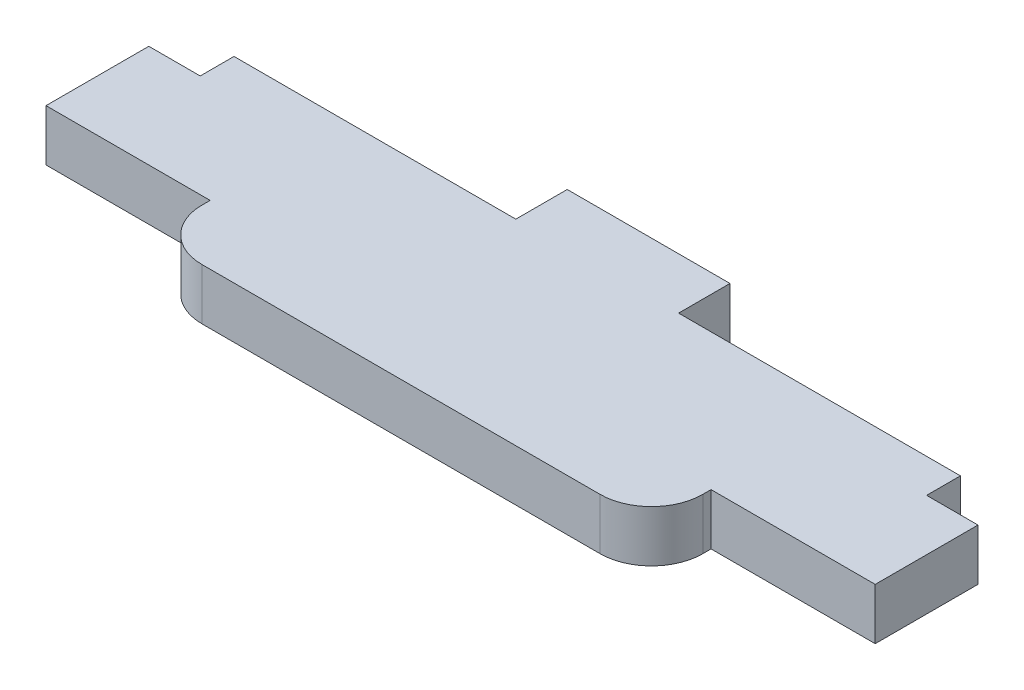
ISO-10303-21;
HEADER;
FILE_DESCRIPTION(('STEP AP214'),'2;1');
FILE_NAME('part.step','',(''),(''),'','','');
FILE_SCHEMA(('AUTOMOTIVE_DESIGN { 1 0 10303 214 1 1 1 1 }'));
ENDSEC;
DATA;
#1=APPLICATION_CONTEXT('core data for automotive mechanical design processes');
#2=APPLICATION_PROTOCOL_DEFINITION('international standard','automotive_design',2000,#1);
#3=PRODUCT_CONTEXT('',#1,'mechanical');
#4=PRODUCT('Part','Part','',(#3));
#5=PRODUCT_RELATED_PRODUCT_CATEGORY('part','',(#4));
#6=PRODUCT_DEFINITION_FORMATION('','',#4);
#7=PRODUCT_DEFINITION_CONTEXT('part definition',#1,'design');
#8=PRODUCT_DEFINITION('design','',#6,#7);
#9=PRODUCT_DEFINITION_SHAPE('','',#8);
#10=(LENGTH_UNIT() NAMED_UNIT(*) SI_UNIT(.MILLI.,.METRE.));
#11=(NAMED_UNIT(*) PLANE_ANGLE_UNIT() SI_UNIT($,.RADIAN.));
#12=(NAMED_UNIT(*) SI_UNIT($,.STERADIAN.) SOLID_ANGLE_UNIT());
#13=UNCERTAINTY_MEASURE_WITH_UNIT(LENGTH_MEASURE(1.E-05),#10,'distance_accuracy_value','');
#14=(GEOMETRIC_REPRESENTATION_CONTEXT(3) GLOBAL_UNCERTAINTY_ASSIGNED_CONTEXT((#13)) GLOBAL_UNIT_ASSIGNED_CONTEXT((#10,
#11,#12)) REPRESENTATION_CONTEXT('',''));
#15=CARTESIAN_POINT('',(0.,0.,0.));
#16=DIRECTION('',(0.,0.,1.));
#17=DIRECTION('',(1.,0.,0.));
#18=AXIS2_PLACEMENT_3D('',#15,#16,#17);
#19=CARTESIAN_POINT('',(70.0878100238819,6.,-6.40569379770578));
#20=DIRECTION('',(0.,-1.,0.));
#21=DIRECTION('',(0.,0.,-1.));
#22=AXIS2_PLACEMENT_3D('',#19,#20,#21);
#23=CYLINDRICAL_SURFACE('',#22,6.);
#24=CARTESIAN_POINT('',(70.0878100238819,0.,-6.40569379770578));
#25=DIRECTION('',(0.,1.,0.));
#26=DIRECTION('',(0.,0.,-1.));
#27=AXIS2_PLACEMENT_3D('',#24,#25,#26);
#28=CIRCLE('',#27,6.);
#29=CARTESIAN_POINT('',(70.0878100238819,0.,-0.405693797705776));
#30=VERTEX_POINT('',#29);
#31=CARTESIAN_POINT('',(76.0878100238819,0.,-6.40569379770582));
#32=VERTEX_POINT('',#31);
#33=EDGE_CURVE('E190',#30,#32,#28,.T.);
#34=ORIENTED_EDGE('',*,*,#33,.T.);
#35=DIRECTION('',(0.,-1.,0.));
#36=VECTOR('',#35,1.);
#37=CARTESIAN_POINT('',(76.0878100238819,6.,-6.40569379770582));
#38=LINE('',#37,#36);
#39=CARTESIAN_POINT('',(76.0878100238819,6.,-6.40569379770582));
#40=VERTEX_POINT('',#39);
#41=EDGE_CURVE('E11',#40,#32,#38,.T.);
#42=ORIENTED_EDGE('',*,*,#41,.F.);
#43=CARTESIAN_POINT('',(70.0878100238819,6.,-6.40569379770578));
#44=DIRECTION('',(0.,1.,0.));
#45=DIRECTION('',(0.,0.,-1.));
#46=AXIS2_PLACEMENT_3D('',#43,#44,#45);
#47=CIRCLE('',#46,6.);
#48=CARTESIAN_POINT('',(70.0878100238819,6.,-0.405693797705776));
#49=VERTEX_POINT('',#48);
#50=EDGE_CURVE('E225',#49,#40,#47,.T.);
#51=ORIENTED_EDGE('',*,*,#50,.F.);
#52=DIRECTION('',(0.,-1.,0.));
#53=VECTOR('',#52,1.);
#54=CARTESIAN_POINT('',(70.0878100238819,6.,-0.405693797705776));
#55=LINE('',#54,#53);
#56=EDGE_CURVE('E186',#49,#30,#55,.T.);
#57=ORIENTED_EDGE('',*,*,#56,.T.);
#58=EDGE_LOOP('',(#34,#42,#51,#57));
#59=FACE_BOUND('',#58,.T.);
#60=ADVANCED_FACE('F33',(#59),#23,.T.);
#61=CARTESIAN_POINT('',(76.0878100238819,6.,-7.36445307657716));
#62=DIRECTION('',(-1.,0.,0.));
#63=DIRECTION('',(0.,0.,1.));
#64=AXIS2_PLACEMENT_3D('',#61,#62,#63);
#65=PLANE('',#64);
#66=DIRECTION('',(0.,0.,-1.));
#67=VECTOR('',#66,1.);
#68=CARTESIAN_POINT('',(76.0878100238819,0.,-7.36445307657716));
#69=LINE('',#68,#67);
#70=CARTESIAN_POINT('',(76.0878100238819,0.,-7.36445307657716));
#71=VERTEX_POINT('',#70);
#72=EDGE_CURVE('E193',#32,#71,#69,.T.);
#73=ORIENTED_EDGE('',*,*,#72,.T.);
#74=DIRECTION('',(0.,-1.,0.));
#75=VECTOR('',#74,1.);
#76=CARTESIAN_POINT('',(76.0878100238819,6.,-7.36445307657716));
#77=LINE('',#76,#75);
#78=CARTESIAN_POINT('',(76.0878100238819,6.,-7.36445307657716));
#79=VERTEX_POINT('',#78);
#80=EDGE_CURVE('E41',#79,#71,#77,.T.);
#81=ORIENTED_EDGE('',*,*,#80,.F.);
#82=DIRECTION('',(0.,0.,-1.));
#83=VECTOR('',#82,1.);
#84=CARTESIAN_POINT('',(76.0878100238819,6.,-7.36445307657716));
#85=LINE('',#84,#83);
#86=EDGE_CURVE('E120',#40,#79,#85,.T.);
#87=ORIENTED_EDGE('',*,*,#86,.F.);
#88=ORIENTED_EDGE('',*,*,#41,.T.);
#89=EDGE_LOOP('',(#73,#81,#87,#88));
#90=FACE_BOUND('',#89,.T.);
#91=ADVANCED_FACE('F323',(#90),#65,.F.);
#92=CARTESIAN_POINT('',(95.2489083524591,6.,-7.36445307657716));
#93=DIRECTION('',(0.,0.,-1.));
#94=DIRECTION('',(-1.,0.,0.));
#95=AXIS2_PLACEMENT_3D('',#92,#93,#94);
#96=PLANE('',#95);
#97=DIRECTION('',(1.,0.,0.));
#98=VECTOR('',#97,1.);
#99=CARTESIAN_POINT('',(95.2489083524591,0.,-7.36445307657716));
#100=LINE('',#99,#98);
#101=CARTESIAN_POINT('',(95.2489083524591,0.,-7.36445307657716));
#102=VERTEX_POINT('',#101);
#103=EDGE_CURVE('E195',#71,#102,#100,.T.);
#104=ORIENTED_EDGE('',*,*,#103,.T.);
#105=DIRECTION('',(0.,-1.,0.));
#106=VECTOR('',#105,1.);
#107=CARTESIAN_POINT('',(95.2489083524591,6.,-7.36445307657716));
#108=LINE('',#107,#106);
#109=CARTESIAN_POINT('',(95.2489083524591,6.,-7.36445307657716));
#110=VERTEX_POINT('',#109);
#111=EDGE_CURVE('E262',#110,#102,#108,.T.);
#112=ORIENTED_EDGE('',*,*,#111,.F.);
#113=DIRECTION('',(1.,0.,0.));
#114=VECTOR('',#113,1.);
#115=CARTESIAN_POINT('',(95.2489083524591,6.,-7.36445307657716));
#116=LINE('',#115,#114);
#117=EDGE_CURVE('E270',#79,#110,#116,.T.);
#118=ORIENTED_EDGE('',*,*,#117,.F.);
#119=ORIENTED_EDGE('',*,*,#80,.T.);
#120=EDGE_LOOP('',(#104,#112,#118,#119));
#121=FACE_BOUND('',#120,.T.);
#122=ADVANCED_FACE('F268',(#121),#96,.F.);
#123=CARTESIAN_POINT('',(95.2489083524591,6.,-7.36445307657716));
#124=DIRECTION('',(-1.,0.,0.));
#125=DIRECTION('',(0.,0.,1.));
#126=AXIS2_PLACEMENT_3D('',#123,#124,#125);
#127=PLANE('',#126);
#128=DIRECTION('',(0.,0.,-1.));
#129=VECTOR('',#128,1.);
#130=CARTESIAN_POINT('',(95.2489083524591,0.,-7.36445307657716));
#131=LINE('',#130,#129);
#132=CARTESIAN_POINT('',(95.2489083524591,0.,-19.3644530765772));
#133=VERTEX_POINT('',#132);
#134=EDGE_CURVE('E197',#102,#133,#131,.T.);
#135=ORIENTED_EDGE('',*,*,#134,.T.);
#136=DIRECTION('',(0.,-1.,0.));
#137=VECTOR('',#136,1.);
#138=CARTESIAN_POINT('',(95.2489083524591,6.,-19.3644530765772));
#139=LINE('',#138,#137);
#140=CARTESIAN_POINT('',(95.2489083524591,6.,-19.3644530765772));
#141=VERTEX_POINT('',#140);
#142=EDGE_CURVE('E259',#141,#133,#139,.T.);
#143=ORIENTED_EDGE('',*,*,#142,.F.);
#144=DIRECTION('',(0.,0.,-1.));
#145=VECTOR('',#144,1.);
#146=CARTESIAN_POINT('',(95.2489083524591,6.,-7.36445307657716));
#147=LINE('',#146,#145);
#148=EDGE_CURVE('E286',#110,#141,#147,.T.);
#149=ORIENTED_EDGE('',*,*,#148,.F.);
#150=ORIENTED_EDGE('',*,*,#111,.T.);
#151=EDGE_LOOP('',(#135,#143,#149,#150));
#152=FACE_BOUND('',#151,.T.);
#153=ADVANCED_FACE('F277',(#152),#127,.F.);
#154=CARTESIAN_POINT('',(95.2489083524591,6.,-19.3644530765772));
#155=DIRECTION('',(0.,0.,1.));
#156=DIRECTION('',(1.,0.,0.));
#157=AXIS2_PLACEMENT_3D('',#154,#155,#156);
#158=PLANE('',#157);
#159=DIRECTION('',(-1.,0.,0.));
#160=VECTOR('',#159,1.);
#161=CARTESIAN_POINT('',(95.2489083524591,0.,-19.3644530765772));
#162=LINE('',#161,#160);
#163=CARTESIAN_POINT('',(89.2489083524591,0.,-19.3644530765772));
#164=VERTEX_POINT('',#163);
#165=EDGE_CURVE('E199',#133,#164,#162,.T.);
#166=ORIENTED_EDGE('',*,*,#165,.T.);
#167=DIRECTION('',(0.,-1.,0.));
#168=VECTOR('',#167,1.);
#169=CARTESIAN_POINT('',(89.2489083524591,6.,-19.3644530765772));
#170=LINE('',#169,#168);
#171=CARTESIAN_POINT('',(89.2489083524591,6.,-19.3644530765772));
#172=VERTEX_POINT('',#171);
#173=EDGE_CURVE('E256',#172,#164,#170,.T.);
#174=ORIENTED_EDGE('',*,*,#173,.F.);
#175=DIRECTION('',(-1.,0.,0.));
#176=VECTOR('',#175,1.);
#177=CARTESIAN_POINT('',(95.2489083524591,6.,-19.3644530765772));
#178=LINE('',#177,#176);
#179=EDGE_CURVE('E283',#141,#172,#178,.T.);
#180=ORIENTED_EDGE('',*,*,#179,.F.);
#181=ORIENTED_EDGE('',*,*,#142,.T.);
#182=EDGE_LOOP('',(#166,#174,#180,#181));
#183=FACE_BOUND('',#182,.T.);
#184=ADVANCED_FACE('F281',(#183),#158,.F.);
#185=CARTESIAN_POINT('',(89.2489083524591,6.,-19.3644530765772));
#186=DIRECTION('',(-1.,0.,0.));
#187=DIRECTION('',(0.,0.,1.));
#188=AXIS2_PLACEMENT_3D('',#185,#186,#187);
#189=PLANE('',#188);
#190=DIRECTION('',(0.,0.,-1.));
#191=VECTOR('',#190,1.);
#192=CARTESIAN_POINT('',(89.2489083524591,0.,-19.3644530765772));
#193=LINE('',#192,#191);
#194=CARTESIAN_POINT('',(89.2489083524591,0.,-23.3111134765772));
#195=VERTEX_POINT('',#194);
#196=EDGE_CURVE('E201',#164,#195,#193,.T.);
#197=ORIENTED_EDGE('',*,*,#196,.T.);
#198=DIRECTION('',(0.,-1.,0.));
#199=VECTOR('',#198,1.);
#200=CARTESIAN_POINT('',(89.2489083524591,6.,-23.3111134765772));
#201=LINE('',#200,#199);
#202=CARTESIAN_POINT('',(89.2489083524591,6.,-23.3111134765772));
#203=VERTEX_POINT('',#202);
#204=EDGE_CURVE('E253',#203,#195,#201,.T.);
#205=ORIENTED_EDGE('',*,*,#204,.F.);
#206=DIRECTION('',(0.,0.,-1.));
#207=VECTOR('',#206,1.);
#208=CARTESIAN_POINT('',(89.2489083524591,6.,-19.3644530765772));
#209=LINE('',#208,#207);
#210=EDGE_CURVE('E285',#172,#203,#209,.T.);
#211=ORIENTED_EDGE('',*,*,#210,.F.);
#212=ORIENTED_EDGE('',*,*,#173,.T.);
#213=EDGE_LOOP('',(#197,#205,#211,#212));
#214=FACE_BOUND('',#213,.T.);
#215=ADVANCED_FACE('F335',(#214),#189,.F.);
#216=CARTESIAN_POINT('',(56.3518187574591,6.,-23.3111134765772));
#217=DIRECTION('',(0.,0.,1.));
#218=DIRECTION('',(1.,0.,0.));
#219=AXIS2_PLACEMENT_3D('',#216,#217,#218);
#220=PLANE('',#219);
#221=DIRECTION('',(-1.,0.,0.));
#222=VECTOR('',#221,1.);
#223=CARTESIAN_POINT('',(56.3518187574591,0.,-23.3111134765772));
#224=LINE('',#223,#222);
#225=CARTESIAN_POINT('',(56.3518187574591,0.,-23.3111134765772));
#226=VERTEX_POINT('',#225);
#227=EDGE_CURVE('E203',#195,#226,#224,.T.);
#228=ORIENTED_EDGE('',*,*,#227,.T.);
#229=DIRECTION('',(0.,-1.,0.));
#230=VECTOR('',#229,1.);
#231=CARTESIAN_POINT('',(56.3518187574591,6.,-23.3111134765772));
#232=LINE('',#231,#230);
#233=CARTESIAN_POINT('',(56.3518187574591,6.,-23.3111134765772));
#234=VERTEX_POINT('',#233);
#235=EDGE_CURVE('E250',#234,#226,#232,.T.);
#236=ORIENTED_EDGE('',*,*,#235,.F.);
#237=DIRECTION('',(-1.,0.,0.));
#238=VECTOR('',#237,1.);
#239=CARTESIAN_POINT('',(56.3518187574591,6.,-23.3111134765772));
#240=LINE('',#239,#238);
#241=EDGE_CURVE('E288',#203,#234,#240,.T.);
#242=ORIENTED_EDGE('',*,*,#241,.F.);
#243=ORIENTED_EDGE('',*,*,#204,.T.);
#244=EDGE_LOOP('',(#228,#236,#242,#243));
#245=FACE_BOUND('',#244,.T.);
#246=ADVANCED_FACE('F338',(#245),#220,.F.);
#247=CARTESIAN_POINT('',(56.3518187574591,6.,-29.3111134765772));
#248=DIRECTION('',(-1.,0.,0.));
#249=DIRECTION('',(0.,0.,1.));
#250=AXIS2_PLACEMENT_3D('',#247,#248,#249);
#251=PLANE('',#250);
#252=DIRECTION('',(0.,0.,-1.));
#253=VECTOR('',#252,1.);
#254=CARTESIAN_POINT('',(56.3518187574591,0.,-29.3111134765772));
#255=LINE('',#254,#253);
#256=CARTESIAN_POINT('',(56.3518187574591,0.,-29.3111134765772));
#257=VERTEX_POINT('',#256);
#258=EDGE_CURVE('E205',#226,#257,#255,.T.);
#259=ORIENTED_EDGE('',*,*,#258,.T.);
#260=DIRECTION('',(0.,-1.,0.));
#261=VECTOR('',#260,1.);
#262=CARTESIAN_POINT('',(56.3518187574591,6.,-29.3111134765772));
#263=LINE('',#262,#261);
#264=CARTESIAN_POINT('',(56.3518187574591,6.,-29.3111134765772));
#265=VERTEX_POINT('',#264);
#266=EDGE_CURVE('E247',#265,#257,#263,.T.);
#267=ORIENTED_EDGE('',*,*,#266,.F.);
#268=DIRECTION('',(0.,0.,-1.));
#269=VECTOR('',#268,1.);
#270=CARTESIAN_POINT('',(56.3518187574591,6.,-29.3111134765772));
#271=LINE('',#270,#269);
#272=EDGE_CURVE('E294',#234,#265,#271,.T.);
#273=ORIENTED_EDGE('',*,*,#272,.F.);
#274=ORIENTED_EDGE('',*,*,#235,.T.);
#275=EDGE_LOOP('',(#259,#267,#273,#274));
#276=FACE_BOUND('',#275,.T.);
#277=ADVANCED_FACE('F342',(#276),#251,.F.);
#278=CARTESIAN_POINT('',(37.3518187574591,6.,-29.3111134765772));
#279=DIRECTION('',(0.,0.,1.));
#280=DIRECTION('',(1.,0.,0.));
#281=AXIS2_PLACEMENT_3D('',#278,#279,#280);
#282=PLANE('',#281);
#283=DIRECTION('',(-1.,0.,0.));
#284=VECTOR('',#283,1.);
#285=CARTESIAN_POINT('',(37.3518187574591,0.,-29.3111134765772));
#286=LINE('',#285,#284);
#287=CARTESIAN_POINT('',(37.3518187574591,0.,-29.3111134765772));
#288=VERTEX_POINT('',#287);
#289=EDGE_CURVE('E207',#257,#288,#286,.T.);
#290=ORIENTED_EDGE('',*,*,#289,.T.);
#291=DIRECTION('',(0.,-1.,0.));
#292=VECTOR('',#291,1.);
#293=CARTESIAN_POINT('',(37.3518187574591,6.,-29.3111134765772));
#294=LINE('',#293,#292);
#295=CARTESIAN_POINT('',(37.3518187574591,6.,-29.3111134765772));
#296=VERTEX_POINT('',#295);
#297=EDGE_CURVE('E244',#296,#288,#294,.T.);
#298=ORIENTED_EDGE('',*,*,#297,.F.);
#299=DIRECTION('',(-1.,0.,0.));
#300=VECTOR('',#299,1.);
#301=CARTESIAN_POINT('',(37.3518187574591,6.,-29.3111134765772));
#302=LINE('',#301,#300);
#303=EDGE_CURVE('E296',#265,#296,#302,.T.);
#304=ORIENTED_EDGE('',*,*,#303,.F.);
#305=ORIENTED_EDGE('',*,*,#266,.T.);
#306=EDGE_LOOP('',(#290,#298,#304,#305));
#307=FACE_BOUND('',#306,.T.);
#308=ADVANCED_FACE('F346',(#307),#282,.F.);
#309=CARTESIAN_POINT('',(37.3518187574591,6.,-29.3111134765772));
#310=DIRECTION('',(1.,0.,0.));
#311=DIRECTION('',(0.,0.,-1.));
#312=AXIS2_PLACEMENT_3D('',#309,#310,#311);
#313=PLANE('',#312);
#314=DIRECTION('',(0.,0.,1.));
#315=VECTOR('',#314,1.);
#316=CARTESIAN_POINT('',(37.3518187574591,0.,-29.3111134765772));
#317=LINE('',#316,#315);
#318=CARTESIAN_POINT('',(37.3518187574591,0.,-23.3111134765772));
#319=VERTEX_POINT('',#318);
#320=EDGE_CURVE('E209',#288,#319,#317,.T.);
#321=ORIENTED_EDGE('',*,*,#320,.T.);
#322=DIRECTION('',(0.,-1.,0.));
#323=VECTOR('',#322,1.);
#324=CARTESIAN_POINT('',(37.3518187574591,6.,-23.3111134765772));
#325=LINE('',#324,#323);
#326=CARTESIAN_POINT('',(37.3518187574591,6.,-23.3111134765772));
#327=VERTEX_POINT('',#326);
#328=EDGE_CURVE('E241',#327,#319,#325,.T.);
#329=ORIENTED_EDGE('',*,*,#328,.F.);
#330=DIRECTION('',(0.,0.,1.));
#331=VECTOR('',#330,1.);
#332=CARTESIAN_POINT('',(37.3518187574591,6.,-29.3111134765772));
#333=LINE('',#332,#331);
#334=EDGE_CURVE('E298',#296,#327,#333,.T.);
#335=ORIENTED_EDGE('',*,*,#334,.F.);
#336=ORIENTED_EDGE('',*,*,#297,.T.);
#337=EDGE_LOOP('',(#321,#329,#335,#336));
#338=FACE_BOUND('',#337,.T.);
#339=ADVANCED_FACE('F350',(#338),#313,.F.);
#340=CARTESIAN_POINT('',(37.3518187574591,6.,-23.3111134765772));
#341=DIRECTION('',(0.,0.,1.));
#342=DIRECTION('',(1.,0.,0.));
#343=AXIS2_PLACEMENT_3D('',#340,#341,#342);
#344=PLANE('',#343);
#345=DIRECTION('',(-1.,0.,0.));
#346=VECTOR('',#345,1.);
#347=CARTESIAN_POINT('',(37.3518187574591,0.,-23.3111134765772));
#348=LINE('',#347,#346);
#349=CARTESIAN_POINT('',(4.45472916245909,0.,-23.3111134765772));
#350=VERTEX_POINT('',#349);
#351=EDGE_CURVE('E211',#319,#350,#348,.T.);
#352=ORIENTED_EDGE('',*,*,#351,.T.);
#353=DIRECTION('',(0.,-1.,0.));
#354=VECTOR('',#353,1.);
#355=CARTESIAN_POINT('',(4.45472916245909,6.,-23.3111134765772));
#356=LINE('',#355,#354);
#357=CARTESIAN_POINT('',(4.45472916245909,6.,-23.3111134765772));
#358=VERTEX_POINT('',#357);
#359=EDGE_CURVE('E238',#358,#350,#356,.T.);
#360=ORIENTED_EDGE('',*,*,#359,.F.);
#361=DIRECTION('',(-1.,0.,0.));
#362=VECTOR('',#361,1.);
#363=CARTESIAN_POINT('',(37.3518187574591,6.,-23.3111134765772));
#364=LINE('',#363,#362);
#365=EDGE_CURVE('E300',#327,#358,#364,.T.);
#366=ORIENTED_EDGE('',*,*,#365,.F.);
#367=ORIENTED_EDGE('',*,*,#328,.T.);
#368=EDGE_LOOP('',(#352,#360,#366,#367));
#369=FACE_BOUND('',#368,.T.);
#370=ADVANCED_FACE('F354',(#369),#344,.F.);
#371=CARTESIAN_POINT('',(4.45472916245909,6.,-19.3644530765772));
#372=DIRECTION('',(1.,0.,0.));
#373=DIRECTION('',(0.,0.,-1.));
#374=AXIS2_PLACEMENT_3D('',#371,#372,#373);
#375=PLANE('',#374);
#376=DIRECTION('',(0.,0.,1.));
#377=VECTOR('',#376,1.);
#378=CARTESIAN_POINT('',(4.45472916245909,0.,-19.3644530765772));
#379=LINE('',#378,#377);
#380=CARTESIAN_POINT('',(4.45472916245909,0.,-19.3644530765772));
#381=VERTEX_POINT('',#380);
#382=EDGE_CURVE('E213',#350,#381,#379,.T.);
#383=ORIENTED_EDGE('',*,*,#382,.T.);
#384=DIRECTION('',(0.,-1.,0.));
#385=VECTOR('',#384,1.);
#386=CARTESIAN_POINT('',(4.45472916245909,6.,-19.3644530765772));
#387=LINE('',#386,#385);
#388=CARTESIAN_POINT('',(4.45472916245909,6.,-19.3644530765772));
#389=VERTEX_POINT('',#388);
#390=EDGE_CURVE('E235',#389,#381,#387,.T.);
#391=ORIENTED_EDGE('',*,*,#390,.F.);
#392=DIRECTION('',(0.,0.,1.));
#393=VECTOR('',#392,1.);
#394=CARTESIAN_POINT('',(4.45472916245909,6.,-19.3644530765772));
#395=LINE('',#394,#393);
#396=EDGE_CURVE('E302',#358,#389,#395,.T.);
#397=ORIENTED_EDGE('',*,*,#396,.F.);
#398=ORIENTED_EDGE('',*,*,#359,.T.);
#399=EDGE_LOOP('',(#383,#391,#397,#398));
#400=FACE_BOUND('',#399,.T.);
#401=ADVANCED_FACE('F358',(#400),#375,.F.);
#402=CARTESIAN_POINT('',(-1.54527083754091,6.,-19.3644530765771));
#403=DIRECTION('',(0.,0.,1.));
#404=DIRECTION('',(1.,0.,0.));
#405=AXIS2_PLACEMENT_3D('',#402,#403,#404);
#406=PLANE('',#405);
#407=DIRECTION('',(-1.,0.,0.));
#408=VECTOR('',#407,1.);
#409=CARTESIAN_POINT('',(-1.54527083754091,0.,-19.3644530765771));
#410=LINE('',#409,#408);
#411=CARTESIAN_POINT('',(-1.54527083754091,0.,-19.3644530765771));
#412=VERTEX_POINT('',#411);
#413=EDGE_CURVE('E215',#381,#412,#410,.T.);
#414=ORIENTED_EDGE('',*,*,#413,.T.);
#415=DIRECTION('',(0.,-1.,0.));
#416=VECTOR('',#415,1.);
#417=CARTESIAN_POINT('',(-1.54527083754091,6.,-19.3644530765771));
#418=LINE('',#417,#416);
#419=CARTESIAN_POINT('',(-1.54527083754091,6.,-19.3644530765771));
#420=VERTEX_POINT('',#419);
#421=EDGE_CURVE('E232',#420,#412,#418,.T.);
#422=ORIENTED_EDGE('',*,*,#421,.F.);
#423=DIRECTION('',(-1.,0.,0.));
#424=VECTOR('',#423,1.);
#425=CARTESIAN_POINT('',(-1.54527083754091,6.,-19.3644530765771));
#426=LINE('',#425,#424);
#427=EDGE_CURVE('E304',#389,#420,#426,.T.);
#428=ORIENTED_EDGE('',*,*,#427,.F.);
#429=ORIENTED_EDGE('',*,*,#390,.T.);
#430=EDGE_LOOP('',(#414,#422,#428,#429));
#431=FACE_BOUND('',#430,.T.);
#432=ADVANCED_FACE('F362',(#431),#406,.F.);
#433=CARTESIAN_POINT('',(-1.54527083754091,6.,-7.36445307657715));
#434=DIRECTION('',(1.,0.,0.));
#435=DIRECTION('',(0.,0.,-1.));
#436=AXIS2_PLACEMENT_3D('',#433,#434,#435);
#437=PLANE('',#436);
#438=DIRECTION('',(0.,0.,1.));
#439=VECTOR('',#438,1.);
#440=CARTESIAN_POINT('',(-1.54527083754091,0.,-7.36445307657715));
#441=LINE('',#440,#439);
#442=CARTESIAN_POINT('',(-1.54527083754091,0.,-7.36445307657715));
#443=VERTEX_POINT('',#442);
#444=EDGE_CURVE('E217',#412,#443,#441,.T.);
#445=ORIENTED_EDGE('',*,*,#444,.T.);
#446=DIRECTION('',(0.,-1.,0.));
#447=VECTOR('',#446,1.);
#448=CARTESIAN_POINT('',(-1.54527083754091,6.,-7.36445307657715));
#449=LINE('',#448,#447);
#450=CARTESIAN_POINT('',(-1.54527083754091,6.,-7.36445307657715));
#451=VERTEX_POINT('',#450);
#452=EDGE_CURVE('E229',#451,#443,#449,.T.);
#453=ORIENTED_EDGE('',*,*,#452,.F.);
#454=DIRECTION('',(0.,0.,1.));
#455=VECTOR('',#454,1.);
#456=CARTESIAN_POINT('',(-1.54527083754091,6.,-7.36445307657715));
#457=LINE('',#456,#455);
#458=EDGE_CURVE('E306',#420,#451,#457,.T.);
#459=ORIENTED_EDGE('',*,*,#458,.F.);
#460=ORIENTED_EDGE('',*,*,#421,.T.);
#461=EDGE_LOOP('',(#445,#453,#459,#460));
#462=FACE_BOUND('',#461,.T.);
#463=ADVANCED_FACE('F312',(#462),#437,.F.);
#464=CARTESIAN_POINT('',(17.6158274910363,6.,-7.36445307657715));
#465=DIRECTION('',(0.,0.,-1.));
#466=DIRECTION('',(-1.,0.,0.));
#467=AXIS2_PLACEMENT_3D('',#464,#465,#466);
#468=PLANE('',#467);
#469=DIRECTION('',(1.,0.,0.));
#470=VECTOR('',#469,1.);
#471=CARTESIAN_POINT('',(17.6158274910363,0.,-7.36445307657715));
#472=LINE('',#471,#470);
#473=CARTESIAN_POINT('',(17.6158274910363,0.,-7.36445307657715));
#474=VERTEX_POINT('',#473);
#475=EDGE_CURVE('E219',#443,#474,#472,.T.);
#476=ORIENTED_EDGE('',*,*,#475,.T.);
#477=DIRECTION('',(0.,-1.,0.));
#478=VECTOR('',#477,1.);
#479=CARTESIAN_POINT('',(17.6158274910363,6.,-7.36445307657715));
#480=LINE('',#479,#478);
#481=CARTESIAN_POINT('',(17.6158274910363,6.,-7.36445307657715));
#482=VERTEX_POINT('',#481);
#483=EDGE_CURVE('E181',#482,#474,#480,.T.);
#484=ORIENTED_EDGE('',*,*,#483,.F.);
#485=DIRECTION('',(1.,0.,0.));
#486=VECTOR('',#485,1.);
#487=CARTESIAN_POINT('',(17.6158274910363,6.,-7.36445307657715));
#488=LINE('',#487,#486);
#489=EDGE_CURVE('E170',#451,#482,#488,.T.);
#490=ORIENTED_EDGE('',*,*,#489,.F.);
#491=ORIENTED_EDGE('',*,*,#452,.T.);
#492=EDGE_LOOP('',(#476,#484,#490,#491));
#493=FACE_BOUND('',#492,.T.);
#494=ADVANCED_FACE('F316',(#493),#468,.F.);
#495=CARTESIAN_POINT('',(17.6158274910363,6.,-6.40569379770582));
#496=DIRECTION('',(1.,0.,0.));
#497=DIRECTION('',(0.,0.,-1.));
#498=AXIS2_PLACEMENT_3D('',#495,#496,#497);
#499=PLANE('',#498);
#500=DIRECTION('',(0.,0.,1.));
#501=VECTOR('',#500,1.);
#502=CARTESIAN_POINT('',(17.6158274910363,0.,-6.40569379770582));
#503=LINE('',#502,#501);
#504=CARTESIAN_POINT('',(17.6158274910363,0.,-6.40569379770582));
#505=VERTEX_POINT('',#504);
#506=EDGE_CURVE('E179',#474,#505,#503,.T.);
#507=ORIENTED_EDGE('',*,*,#506,.T.);
#508=DIRECTION('',(0.,-1.,0.));
#509=VECTOR('',#508,1.);
#510=CARTESIAN_POINT('',(17.6158274910363,6.,-6.40569379770582));
#511=LINE('',#510,#509);
#512=CARTESIAN_POINT('',(17.6158274910363,6.,-6.40569379770582));
#513=VERTEX_POINT('',#512);
#514=EDGE_CURVE('E176',#513,#505,#511,.T.);
#515=ORIENTED_EDGE('',*,*,#514,.F.);
#516=DIRECTION('',(0.,0.,1.));
#517=VECTOR('',#516,1.);
#518=CARTESIAN_POINT('',(17.6158274910363,6.,-6.40569379770582));
#519=LINE('',#518,#517);
#520=EDGE_CURVE('E163',#482,#513,#519,.T.);
#521=ORIENTED_EDGE('',*,*,#520,.F.);
#522=ORIENTED_EDGE('',*,*,#483,.T.);
#523=EDGE_LOOP('',(#507,#515,#521,#522));
#524=FACE_BOUND('',#523,.T.);
#525=ADVANCED_FACE('F177',(#524),#499,.F.);
#526=CARTESIAN_POINT('',(23.6158274910363,6.,-6.40569379770578));
#527=DIRECTION('',(0.,-1.,0.));
#528=DIRECTION('',(0.,0.,-1.));
#529=AXIS2_PLACEMENT_3D('',#526,#527,#528);
#530=CYLINDRICAL_SURFACE('',#529,6.);
#531=CARTESIAN_POINT('',(23.6158274910363,0.,-6.40569379770578));
#532=DIRECTION('',(0.,1.,0.));
#533=DIRECTION('',(0.,0.,1.));
#534=AXIS2_PLACEMENT_3D('',#531,#532,#533);
#535=CIRCLE('',#534,6.);
#536=CARTESIAN_POINT('',(23.6158274910363,0.,-0.405693797705777));
#537=VERTEX_POINT('',#536);
#538=EDGE_CURVE('E222',#505,#537,#535,.T.);
#539=ORIENTED_EDGE('',*,*,#538,.T.);
#540=DIRECTION('',(0.,-1.,0.));
#541=VECTOR('',#540,1.);
#542=CARTESIAN_POINT('',(23.6158274910363,6.,-0.405693797705777));
#543=LINE('',#542,#541);
#544=CARTESIAN_POINT('',(23.6158274910363,6.,-0.405693797705777));
#545=VERTEX_POINT('',#544);
#546=EDGE_CURVE('E182',#545,#537,#543,.T.);
#547=ORIENTED_EDGE('',*,*,#546,.F.);
#548=CARTESIAN_POINT('',(23.6158274910363,6.,-6.40569379770578));
#549=DIRECTION('',(0.,1.,0.));
#550=DIRECTION('',(0.,0.,1.));
#551=AXIS2_PLACEMENT_3D('',#548,#549,#550);
#552=CIRCLE('',#551,6.);
#553=EDGE_CURVE('E167',#513,#545,#552,.T.);
#554=ORIENTED_EDGE('',*,*,#553,.F.);
#555=ORIENTED_EDGE('',*,*,#514,.T.);
#556=EDGE_LOOP('',(#539,#547,#554,#555));
#557=FACE_BOUND('',#556,.T.);
#558=ADVANCED_FACE('F184',(#557),#530,.T.);
#559=CARTESIAN_POINT('',(70.0878100238819,6.,-0.405693797705776));
#560=DIRECTION('',(0.,0.,-1.));
#561=DIRECTION('',(-1.,0.,0.));
#562=AXIS2_PLACEMENT_3D('',#559,#560,#561);
#563=PLANE('',#562);
#564=DIRECTION('',(1.,0.,0.));
#565=VECTOR('',#564,1.);
#566=CARTESIAN_POINT('',(70.0878100238819,0.,-0.405693797705776));
#567=LINE('',#566,#565);
#568=EDGE_CURVE('E108',#537,#30,#567,.T.);
#569=ORIENTED_EDGE('',*,*,#568,.T.);
#570=ORIENTED_EDGE('',*,*,#56,.F.);
#571=DIRECTION('',(1.,0.,0.));
#572=VECTOR('',#571,1.);
#573=CARTESIAN_POINT('',(40.2068590818868,6.,-0.405693797705778));
#574=LINE('',#573,#572);
#575=EDGE_CURVE('E49',#545,#49,#574,.T.);
#576=ORIENTED_EDGE('',*,*,#575,.F.);
#577=ORIENTED_EDGE('',*,*,#546,.T.);
#578=EDGE_LOOP('',(#569,#570,#576,#577));
#579=FACE_BOUND('',#578,.T.);
#580=ADVANCED_FACE('F317',(#579),#563,.F.);
#581=CARTESIAN_POINT('',(70.0878100238819,6.,-6.40569379770578));
#582=DIRECTION('',(0.,-1.,0.));
#583=DIRECTION('',(0.,0.,-1.));
#584=AXIS2_PLACEMENT_3D('',#581,#582,#583);
#585=PLANE('',#584);
#586=ORIENTED_EDGE('',*,*,#50,.T.);
#587=ORIENTED_EDGE('',*,*,#86,.T.);
#588=ORIENTED_EDGE('',*,*,#117,.T.);
#589=ORIENTED_EDGE('',*,*,#148,.T.);
#590=ORIENTED_EDGE('',*,*,#179,.T.);
#591=ORIENTED_EDGE('',*,*,#210,.T.);
#592=ORIENTED_EDGE('',*,*,#241,.T.);
#593=ORIENTED_EDGE('',*,*,#272,.T.);
#594=ORIENTED_EDGE('',*,*,#303,.T.);
#595=ORIENTED_EDGE('',*,*,#334,.T.);
#596=ORIENTED_EDGE('',*,*,#365,.T.);
#597=ORIENTED_EDGE('',*,*,#396,.T.);
#598=ORIENTED_EDGE('',*,*,#427,.T.);
#599=ORIENTED_EDGE('',*,*,#458,.T.);
#600=ORIENTED_EDGE('',*,*,#489,.T.);
#601=ORIENTED_EDGE('',*,*,#520,.T.);
#602=ORIENTED_EDGE('',*,*,#553,.T.);
#603=ORIENTED_EDGE('',*,*,#575,.T.);
#604=EDGE_LOOP('',(#586,#587,#588,#589,#590,#591,#592,#593,#594,#595,#596,#597,#598,#599,#600,
#601,#602,#603));
#605=FACE_BOUND('',#604,.T.);
#606=ADVANCED_FACE('F165',(#605),#585,.F.);
#607=CARTESIAN_POINT('',(70.0878100238819,0.,-6.40569379770578));
#608=DIRECTION('',(0.,-1.,0.));
#609=DIRECTION('',(0.,0.,-1.));
#610=AXIS2_PLACEMENT_3D('',#607,#608,#609);
#611=PLANE('',#610);
#612=ORIENTED_EDGE('',*,*,#33,.F.);
#613=ORIENTED_EDGE('',*,*,#568,.F.);
#614=ORIENTED_EDGE('',*,*,#538,.F.);
#615=ORIENTED_EDGE('',*,*,#506,.F.);
#616=ORIENTED_EDGE('',*,*,#475,.F.);
#617=ORIENTED_EDGE('',*,*,#444,.F.);
#618=ORIENTED_EDGE('',*,*,#413,.F.);
#619=ORIENTED_EDGE('',*,*,#382,.F.);
#620=ORIENTED_EDGE('',*,*,#351,.F.);
#621=ORIENTED_EDGE('',*,*,#320,.F.);
#622=ORIENTED_EDGE('',*,*,#289,.F.);
#623=ORIENTED_EDGE('',*,*,#258,.F.);
#624=ORIENTED_EDGE('',*,*,#227,.F.);
#625=ORIENTED_EDGE('',*,*,#196,.F.);
#626=ORIENTED_EDGE('',*,*,#165,.F.);
#627=ORIENTED_EDGE('',*,*,#134,.F.);
#628=ORIENTED_EDGE('',*,*,#103,.F.);
#629=ORIENTED_EDGE('',*,*,#72,.F.);
#630=EDGE_LOOP('',(#612,#613,#614,#615,#616,#617,#618,#619,#620,#621,#622,#623,#624,#625,#626,
#627,#628,#629));
#631=FACE_BOUND('',#630,.T.);
#632=ADVANCED_FACE('F272',(#631),#611,.T.);
#633=CLOSED_SHELL('',(#60,#91,#122,#153,#184,#215,#246,#277,#308,#339,#370,#401,#432,#463,#494,
#525,#558,#580,#606,#632));
#634=MANIFOLD_SOLID_BREP('B2',#633);
#635=ADVANCED_BREP_SHAPE_REPRESENTATION('',(#18,#634),#14);
#636=SHAPE_DEFINITION_REPRESENTATION(#9,#635);
ENDSEC;
END-ISO-10303-21;
